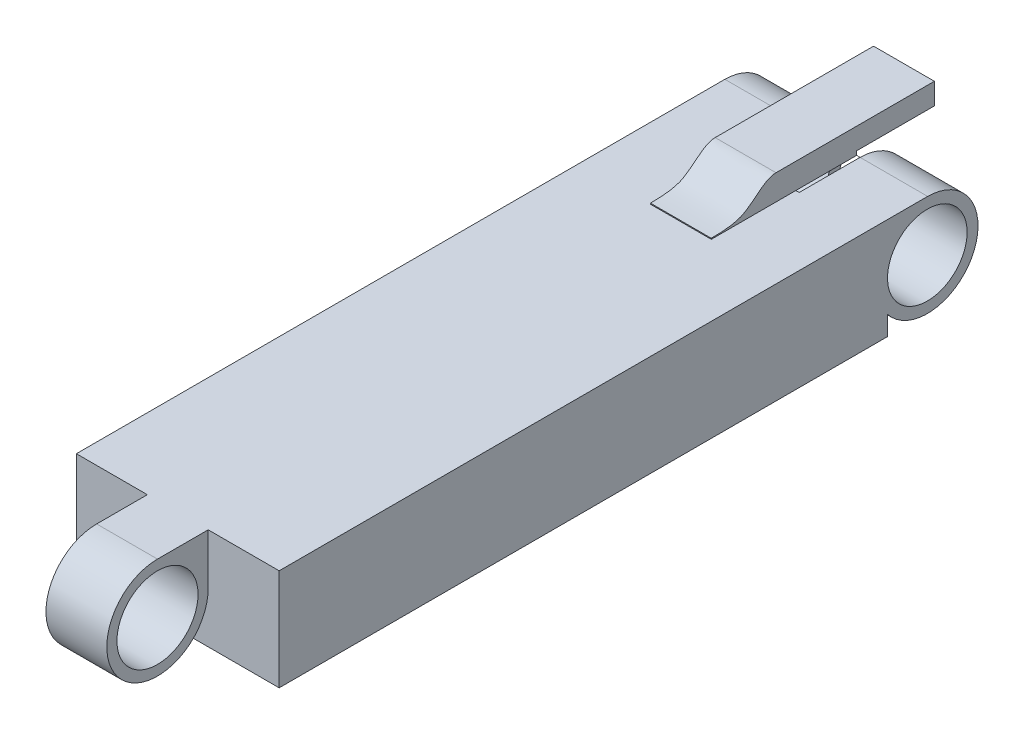
ISO-10303-21;
HEADER;
FILE_DESCRIPTION(('STEP AP214'),'2;1');
FILE_NAME('part.step','',(''),(''),'','','');
FILE_SCHEMA(('AUTOMOTIVE_DESIGN { 1 0 10303 214 1 1 1 1 }'));
ENDSEC;
DATA;
#1=APPLICATION_CONTEXT('core data for automotive mechanical design processes');
#2=APPLICATION_PROTOCOL_DEFINITION('international standard','automotive_design',2000,#1);
#3=PRODUCT_CONTEXT('',#1,'mechanical');
#4=PRODUCT('Part','Part','',(#3));
#5=PRODUCT_RELATED_PRODUCT_CATEGORY('part','',(#4));
#6=PRODUCT_DEFINITION_FORMATION('','',#4);
#7=PRODUCT_DEFINITION_CONTEXT('part definition',#1,'design');
#8=PRODUCT_DEFINITION('design','',#6,#7);
#9=PRODUCT_DEFINITION_SHAPE('','',#8);
#10=(LENGTH_UNIT() NAMED_UNIT(*) SI_UNIT(.MILLI.,.METRE.));
#11=(NAMED_UNIT(*) PLANE_ANGLE_UNIT() SI_UNIT($,.RADIAN.));
#12=(NAMED_UNIT(*) SI_UNIT($,.STERADIAN.) SOLID_ANGLE_UNIT());
#13=UNCERTAINTY_MEASURE_WITH_UNIT(LENGTH_MEASURE(1.E-05),#10,'distance_accuracy_value','');
#14=(GEOMETRIC_REPRESENTATION_CONTEXT(3) GLOBAL_UNCERTAINTY_ASSIGNED_CONTEXT((#13)) GLOBAL_UNIT_ASSIGNED_CONTEXT((#10,
#11,#12)) REPRESENTATION_CONTEXT('',''));
#15=CARTESIAN_POINT('',(0.,0.,0.));
#16=DIRECTION('',(0.,0.,1.));
#17=DIRECTION('',(1.,0.,0.));
#18=AXIS2_PLACEMENT_3D('',#15,#16,#17);
#19=CARTESIAN_POINT('',(10.,0.,0.));
#20=DIRECTION('',(0.,0.,1.));
#21=DIRECTION('',(1.,0.,0.));
#22=AXIS2_PLACEMENT_3D('',#19,#20,#21);
#23=PLANE('',#22);
#24=DIRECTION('',(1.,0.,0.));
#25=VECTOR('',#24,1.);
#26=CARTESIAN_POINT('',(3.5,2.5,0.));
#27=LINE('',#26,#25);
#28=CARTESIAN_POINT('',(3.5,2.5,0.));
#29=VERTEX_POINT('',#28);
#30=CARTESIAN_POINT('',(6.5,2.5,0.));
#31=VERTEX_POINT('',#30);
#32=EDGE_CURVE('E593',#29,#31,#27,.T.);
#33=ORIENTED_EDGE('',*,*,#32,.F.);
#34=DIRECTION('',(0.,1.,0.));
#35=VECTOR('',#34,1.);
#36=CARTESIAN_POINT('',(3.5,5.,0.));
#37=LINE('',#36,#35);
#38=CARTESIAN_POINT('',(3.5,5.,0.));
#39=VERTEX_POINT('',#38);
#40=EDGE_CURVE('E550',#29,#39,#37,.T.);
#41=ORIENTED_EDGE('',*,*,#40,.T.);
#42=DIRECTION('',(-1.,0.,0.));
#43=VECTOR('',#42,1.);
#44=CARTESIAN_POINT('',(10.,5.,0.));
#45=LINE('',#44,#43);
#46=CARTESIAN_POINT('',(0.,5.,0.));
#47=VERTEX_POINT('',#46);
#48=EDGE_CURVE('E420',#39,#47,#45,.T.);
#49=ORIENTED_EDGE('',*,*,#48,.T.);
#50=DIRECTION('',(0.,1.,0.));
#51=VECTOR('',#50,1.);
#52=CARTESIAN_POINT('',(0.,0.,0.));
#53=LINE('',#52,#51);
#54=CARTESIAN_POINT('',(0.,0.,0.));
#55=VERTEX_POINT('',#54);
#56=EDGE_CURVE('E529',#55,#47,#53,.T.);
#57=ORIENTED_EDGE('',*,*,#56,.F.);
#58=DIRECTION('',(-1.,0.,0.));
#59=VECTOR('',#58,1.);
#60=CARTESIAN_POINT('',(10.,0.,0.));
#61=LINE('',#60,#59);
#62=CARTESIAN_POINT('',(10.,0.,0.));
#63=VERTEX_POINT('',#62);
#64=EDGE_CURVE('E541',#63,#55,#61,.T.);
#65=ORIENTED_EDGE('',*,*,#64,.F.);
#66=DIRECTION('',(0.,1.,0.));
#67=VECTOR('',#66,1.);
#68=CARTESIAN_POINT('',(10.,0.,0.));
#69=LINE('',#68,#67);
#70=CARTESIAN_POINT('',(10.,5.,0.));
#71=VERTEX_POINT('',#70);
#72=EDGE_CURVE('E512',#63,#71,#69,.T.);
#73=ORIENTED_EDGE('',*,*,#72,.T.);
#74=CARTESIAN_POINT('',(6.5,5.,0.));
#75=VERTEX_POINT('',#74);
#76=EDGE_CURVE('E415',#71,#75,#45,.T.);
#77=ORIENTED_EDGE('',*,*,#76,.T.);
#78=DIRECTION('',(0.,1.,0.));
#79=VECTOR('',#78,1.);
#80=CARTESIAN_POINT('',(6.5,5.,0.));
#81=LINE('',#80,#79);
#82=EDGE_CURVE('E564',#31,#75,#81,.T.);
#83=ORIENTED_EDGE('',*,*,#82,.F.);
#84=EDGE_LOOP('',(#33,#41,#49,#57,#65,#73,#77,#83));
#85=FACE_BOUND('',#84,.T.);
#86=ADVANCED_FACE('F47',(#85),#23,.T.);
#87=CARTESIAN_POINT('',(10.,2.5,-31.9626369026869));
#88=DIRECTION('',(-1.,0.,0.));
#89=DIRECTION('',(0.,0.,1.));
#90=AXIS2_PLACEMENT_3D('',#87,#88,#89);
#91=CYLINDRICAL_SURFACE('',#90,1.96263690268693);
#92=CARTESIAN_POINT('',(6.66666666666667,2.5,-31.9626369026869));
#93=DIRECTION('',(1.,0.,0.));
#94=DIRECTION('',(0.,0.,-1.));
#95=AXIS2_PLACEMENT_3D('',#92,#93,#94);
#96=CIRCLE('',#95,1.96263690268693);
#97=CARTESIAN_POINT('',(6.66666666666667,2.5,-33.9252738053739));
#98=VERTEX_POINT('',#97);
#99=EDGE_CURVE('E451',#98,#98,#96,.T.);
#100=ORIENTED_EDGE('',*,*,#99,.F.);
#101=EDGE_LOOP('',(#100));
#102=FACE_BOUND('',#101,.T.);
#103=CARTESIAN_POINT('',(10.,2.5,-31.9626369026869));
#104=DIRECTION('',(1.,0.,0.));
#105=DIRECTION('',(0.,0.,-1.));
#106=AXIS2_PLACEMENT_3D('',#103,#104,#105);
#107=CIRCLE('',#106,1.96263690268693);
#108=CARTESIAN_POINT('',(10.,2.5,-33.9252738053739));
#109=VERTEX_POINT('',#108);
#110=EDGE_CURVE('E498',#109,#109,#107,.T.);
#111=ORIENTED_EDGE('',*,*,#110,.T.);
#112=EDGE_LOOP('',(#111));
#113=FACE_BOUND('',#112,.T.);
#114=ADVANCED_FACE('F365',(#102,#113),#91,.F.);
#115=CARTESIAN_POINT('',(10.,-0.208321197407538,-31.9449752607478));
#116=DIRECTION('',(0.,-0.00652111220123307,-0.999978737321779));
#117=DIRECTION('',(0.,0.999978737321779,-0.00652111220123307));
#118=AXIS2_PLACEMENT_3D('',#115,#116,#117);
#119=PLANE('',#118);
#120=DIRECTION('',(1.,0.,0.));
#121=VECTOR('',#120,1.);
#122=CARTESIAN_POINT('',(6.66666666666667,4.99994684330445,-31.97893968319));
#123=LINE('',#122,#121);
#124=CARTESIAN_POINT('',(3.33333333333333,4.99994684330445,-31.97893968319));
#125=VERTEX_POINT('',#124);
#126=CARTESIAN_POINT('',(6.66666666666667,4.99994684330445,-31.97893968319));
#127=VERTEX_POINT('',#126);
#128=EDGE_CURVE('E621',#125,#127,#123,.T.);
#129=ORIENTED_EDGE('',*,*,#128,.F.);
#130=DIRECTION('',(-1.,0.,0.));
#131=VECTOR('',#130,1.);
#132=CARTESIAN_POINT('',(3.33333333333333,4.99994684330445,-31.97893968319));
#133=LINE('',#132,#131);
#134=CARTESIAN_POINT('',(0.,4.99994684330445,-31.97893968319));
#135=VERTEX_POINT('',#134);
#136=EDGE_CURVE('E493',#135,#125,#133,.F.);
#137=ORIENTED_EDGE('',*,*,#136,.F.);
#138=DIRECTION('',(0.,-0.999978737321779,0.00652111220123306));
#139=VECTOR('',#138,1.);
#140=CARTESIAN_POINT('',(0.,-0.208321197407538,-31.9449752607478));
#141=LINE('',#140,#139);
#142=CARTESIAN_POINT('',(0.,5.,-31.9789400298382));
#143=VERTEX_POINT('',#142);
#144=EDGE_CURVE('E412',#143,#135,#141,.T.);
#145=ORIENTED_EDGE('',*,*,#144,.F.);
#146=DIRECTION('',(-1.,0.,0.));
#147=VECTOR('',#146,1.);
#148=CARTESIAN_POINT('',(10.,5.,-31.9789400298382));
#149=LINE('',#148,#147);
#150=CARTESIAN_POINT('',(3.5,5.,-31.9789400298382));
#151=VERTEX_POINT('',#150);
#152=EDGE_CURVE('E395',#151,#143,#149,.T.);
#153=ORIENTED_EDGE('',*,*,#152,.F.);
#154=DIRECTION('',(-1.,0.,0.));
#155=VECTOR('',#154,1.);
#156=CARTESIAN_POINT('',(10.,5.,-31.9789400298382));
#157=LINE('',#156,#155);
#158=CARTESIAN_POINT('',(6.5,5.,-31.9789400298382));
#159=VERTEX_POINT('',#158);
#160=EDGE_CURVE('E409',#159,#151,#157,.T.);
#161=ORIENTED_EDGE('',*,*,#160,.F.);
#162=CARTESIAN_POINT('',(10.,5.,-31.9789400298382));
#163=VERTEX_POINT('',#162);
#164=EDGE_CURVE('E414',#163,#159,#149,.T.);
#165=ORIENTED_EDGE('',*,*,#164,.F.);
#166=DIRECTION('',(0.,-0.999978737321779,0.00652111220123306));
#167=VECTOR('',#166,1.);
#168=CARTESIAN_POINT('',(10.,-0.208321197407538,-31.9449752607478));
#169=LINE('',#168,#167);
#170=CARTESIAN_POINT('',(10.,4.99994684330445,-31.97893968319));
#171=VERTEX_POINT('',#170);
#172=EDGE_CURVE('E505',#163,#171,#169,.T.);
#173=ORIENTED_EDGE('',*,*,#172,.T.);
#174=DIRECTION('',(1.,0.,0.));
#175=VECTOR('',#174,1.);
#176=CARTESIAN_POINT('',(6.66666666666667,4.99994684330445,-31.97893968319));
#177=LINE('',#176,#175);
#178=EDGE_CURVE('E474',#127,#171,#177,.T.);
#179=ORIENTED_EDGE('',*,*,#178,.F.);
#180=EDGE_LOOP('',(#129,#137,#145,#153,#161,#165,#173,#179));
#181=FACE_BOUND('',#180,.T.);
#182=ADVANCED_FACE('F49',(#181),#119,.T.);
#183=CARTESIAN_POINT('',(10.,5.,0.));
#184=DIRECTION('',(0.,1.,0.));
#185=DIRECTION('',(0.,0.,1.));
#186=AXIS2_PLACEMENT_3D('',#183,#184,#185);
#187=PLANE('',#186);
#188=DIRECTION('',(0.,0.,-1.));
#189=VECTOR('',#188,1.);
#190=CARTESIAN_POINT('',(3.5,5.,-24.8091377548968));
#191=LINE('',#190,#189);
#192=CARTESIAN_POINT('',(3.5,5.,-31.9707883796));
#193=VERTEX_POINT('',#192);
#194=EDGE_CURVE('E392',#193,#151,#191,.T.);
#195=ORIENTED_EDGE('',*,*,#194,.T.);
#196=ORIENTED_EDGE('',*,*,#152,.T.);
#197=DIRECTION('',(0.,0.,-1.));
#198=VECTOR('',#197,1.);
#199=CARTESIAN_POINT('',(0.,5.,0.));
#200=LINE('',#199,#198);
#201=EDGE_CURVE('E526',#47,#143,#200,.T.);
#202=ORIENTED_EDGE('',*,*,#201,.F.);
#203=ORIENTED_EDGE('',*,*,#48,.F.);
#204=DIRECTION('',(0.,0.,1.));
#205=VECTOR('',#204,1.);
#206=CARTESIAN_POINT('',(3.5,5.,2.5));
#207=LINE('',#206,#205);
#208=CARTESIAN_POINT('',(3.5,5.,2.5));
#209=VERTEX_POINT('',#208);
#210=EDGE_CURVE('E590',#39,#209,#207,.T.);
#211=ORIENTED_EDGE('',*,*,#210,.T.);
#212=DIRECTION('',(1.,0.,0.));
#213=VECTOR('',#212,1.);
#214=CARTESIAN_POINT('',(3.5,5.,2.5));
#215=LINE('',#214,#213);
#216=CARTESIAN_POINT('',(6.5,5.,2.5));
#217=VERTEX_POINT('',#216);
#218=EDGE_CURVE('E575',#209,#217,#215,.T.);
#219=ORIENTED_EDGE('',*,*,#218,.T.);
#220=DIRECTION('',(0.,0.,1.));
#221=VECTOR('',#220,1.);
#222=CARTESIAN_POINT('',(6.5,5.,2.5));
#223=LINE('',#222,#221);
#224=EDGE_CURVE('E570',#75,#217,#223,.T.);
#225=ORIENTED_EDGE('',*,*,#224,.F.);
#226=ORIENTED_EDGE('',*,*,#76,.F.);
#227=DIRECTION('',(0.,0.,-1.));
#228=VECTOR('',#227,1.);
#229=CARTESIAN_POINT('',(10.,5.,0.));
#230=LINE('',#229,#228);
#231=EDGE_CURVE('E508',#71,#163,#230,.T.);
#232=ORIENTED_EDGE('',*,*,#231,.T.);
#233=ORIENTED_EDGE('',*,*,#164,.T.);
#234=DIRECTION('',(0.,0.,-1.));
#235=VECTOR('',#234,1.);
#236=CARTESIAN_POINT('',(6.5,5.,-24.8091377548968));
#237=LINE('',#236,#235);
#238=CARTESIAN_POINT('',(6.5,5.,-31.9707883796));
#239=VERTEX_POINT('',#238);
#240=EDGE_CURVE('E277',#239,#159,#237,.T.);
#241=ORIENTED_EDGE('',*,*,#240,.F.);
#242=DIRECTION('',(-1.,0.,0.));
#243=VECTOR('',#242,1.);
#244=CARTESIAN_POINT('',(10.,5.,-31.9707883796));
#245=LINE('',#244,#243);
#246=CARTESIAN_POINT('',(6.66666666666667,5.,-31.9707883796));
#247=VERTEX_POINT('',#246);
#248=EDGE_CURVE('E11',#247,#239,#245,.T.);
#249=ORIENTED_EDGE('',*,*,#248,.F.);
#250=DIRECTION('',(0.,0.,-1.));
#251=VECTOR('',#250,1.);
#252=CARTESIAN_POINT('',(6.66666666666667,5.,0.));
#253=LINE('',#252,#251);
#254=CARTESIAN_POINT('',(6.66666666666667,5.,-28.9788762404472));
#255=VERTEX_POINT('',#254);
#256=EDGE_CURVE('E460',#255,#247,#253,.T.);
#257=ORIENTED_EDGE('',*,*,#256,.F.);
#258=DIRECTION('',(-1.,0.,0.));
#259=VECTOR('',#258,1.);
#260=CARTESIAN_POINT('',(10.,5.,-28.9788762404472));
#261=LINE('',#260,#259);
#262=CARTESIAN_POINT('',(6.5,5.,-28.9788762404472));
#263=VERTEX_POINT('',#262);
#264=EDGE_CURVE('E423',#255,#263,#261,.T.);
#265=ORIENTED_EDGE('',*,*,#264,.T.);
#266=CARTESIAN_POINT('',(6.5,5.,-24.8091377548968));
#267=VERTEX_POINT('',#266);
#268=EDGE_CURVE('E278',#267,#263,#237,.T.);
#269=ORIENTED_EDGE('',*,*,#268,.F.);
#270=DIRECTION('',(1.,0.,0.));
#271=VECTOR('',#270,1.);
#272=CARTESIAN_POINT('',(3.5,5.,-24.8091377548968));
#273=LINE('',#272,#271);
#274=CARTESIAN_POINT('',(3.5,5.,-24.8091377548968));
#275=VERTEX_POINT('',#274);
#276=EDGE_CURVE('E71',#275,#267,#273,.T.);
#277=ORIENTED_EDGE('',*,*,#276,.F.);
#278=CARTESIAN_POINT('',(3.5,5.,-28.9788762404472));
#279=VERTEX_POINT('',#278);
#280=EDGE_CURVE('E404',#275,#279,#191,.T.);
#281=ORIENTED_EDGE('',*,*,#280,.T.);
#282=CARTESIAN_POINT('',(3.33333333333333,5.,-28.9788762404472));
#283=VERTEX_POINT('',#282);
#284=EDGE_CURVE('E419',#279,#283,#261,.T.);
#285=ORIENTED_EDGE('',*,*,#284,.T.);
#286=DIRECTION('',(0.,0.,1.));
#287=VECTOR('',#286,1.);
#288=CARTESIAN_POINT('',(3.33333333333333,5.,0.));
#289=LINE('',#288,#287);
#290=CARTESIAN_POINT('',(3.33333333333333,4.99999999999997,-31.9707883796089));
#291=VERTEX_POINT('',#290);
#292=EDGE_CURVE('E435',#291,#283,#289,.T.);
#293=ORIENTED_EDGE('',*,*,#292,.F.);
#294=EDGE_CURVE('E56',#193,#291,#245,.T.);
#295=ORIENTED_EDGE('',*,*,#294,.F.);
#296=EDGE_LOOP('',(#195,#196,#202,#203,#211,#219,#225,#226,#232,#233,#241,#249,#257,#265,#269,
#277,#281,#285,#293,#295));
#297=FACE_BOUND('',#296,.T.);
#298=ADVANCED_FACE('F380',(#297),#187,.T.);
#299=CARTESIAN_POINT('',(10.,0.,0.));
#300=DIRECTION('',(0.,1.,0.));
#301=DIRECTION('',(0.,0.,1.));
#302=AXIS2_PLACEMENT_3D('',#299,#300,#301);
#303=PLANE('',#302);
#304=DIRECTION('',(-1.,0.,0.));
#305=VECTOR('',#304,1.);
#306=CARTESIAN_POINT('',(10.,0.,-29.9836551410445));
#307=LINE('',#306,#305);
#308=CARTESIAN_POINT('',(6.66666666666667,0.,-29.9836551410445));
#309=VERTEX_POINT('',#308);
#310=CARTESIAN_POINT('',(3.33333333333333,0.,-29.9836551410445));
#311=VERTEX_POINT('',#310);
#312=EDGE_CURVE('E614',#309,#311,#307,.T.);
#313=ORIENTED_EDGE('',*,*,#312,.T.);
#314=DIRECTION('',(0.,0.,1.));
#315=VECTOR('',#314,1.);
#316=CARTESIAN_POINT('',(3.33333333333333,0.,0.));
#317=LINE('',#316,#315);
#318=CARTESIAN_POINT('',(3.33333333333333,0.,-28.9462699861447));
#319=VERTEX_POINT('',#318);
#320=EDGE_CURVE('E618',#311,#319,#317,.T.);
#321=ORIENTED_EDGE('',*,*,#320,.T.);
#322=DIRECTION('',(1.,0.,0.));
#323=VECTOR('',#322,1.);
#324=CARTESIAN_POINT('',(10.,0.,-28.9462699861447));
#325=LINE('',#324,#323);
#326=CARTESIAN_POINT('',(6.66666666666667,0.,-28.9462699861447));
#327=VERTEX_POINT('',#326);
#328=EDGE_CURVE('E439',#319,#327,#325,.T.);
#329=ORIENTED_EDGE('',*,*,#328,.T.);
#330=DIRECTION('',(0.,0.,-1.));
#331=VECTOR('',#330,1.);
#332=CARTESIAN_POINT('',(6.66666666666667,0.,0.));
#333=LINE('',#332,#331);
#334=EDGE_CURVE('E610',#327,#309,#333,.T.);
#335=ORIENTED_EDGE('',*,*,#334,.T.);
#336=EDGE_LOOP('',(#313,#321,#329,#335));
#337=FACE_BOUND('',#336,.T.);
#338=DIRECTION('',(0.,0.,-1.));
#339=VECTOR('',#338,1.);
#340=CARTESIAN_POINT('',(0.,0.,0.));
#341=LINE('',#340,#339);
#342=CARTESIAN_POINT('',(0.,0.,-30.));
#343=VERTEX_POINT('',#342);
#344=EDGE_CURVE('E533',#55,#343,#341,.T.);
#345=ORIENTED_EDGE('',*,*,#344,.T.);
#346=DIRECTION('',(-1.,0.,0.));
#347=VECTOR('',#346,1.);
#348=CARTESIAN_POINT('',(10.,0.,-30.));
#349=LINE('',#348,#347);
#350=CARTESIAN_POINT('',(10.,0.,-30.));
#351=VERTEX_POINT('',#350);
#352=EDGE_CURVE('E523',#351,#343,#349,.T.);
#353=ORIENTED_EDGE('',*,*,#352,.F.);
#354=DIRECTION('',(0.,0.,-1.));
#355=VECTOR('',#354,1.);
#356=CARTESIAN_POINT('',(10.,0.,0.));
#357=LINE('',#356,#355);
#358=EDGE_CURVE('E516',#63,#351,#357,.T.);
#359=ORIENTED_EDGE('',*,*,#358,.F.);
#360=ORIENTED_EDGE('',*,*,#64,.T.);
#361=EDGE_LOOP('',(#345,#353,#359,#360));
#362=FACE_BOUND('',#361,.T.);
#363=ADVANCED_FACE('F376',(#337,#362),#303,.F.);
#364=CARTESIAN_POINT('',(10.,0.,-30.));
#365=DIRECTION('',(0.,0.,1.));
#366=DIRECTION('',(1.,0.,0.));
#367=AXIS2_PLACEMENT_3D('',#364,#365,#366);
#368=PLANE('',#367);
#369=DIRECTION('',(1.,0.,0.));
#370=VECTOR('',#369,1.);
#371=CARTESIAN_POINT('',(10.,0.0127456897646467,-30.));
#372=LINE('',#371,#370);
#373=CARTESIAN_POINT('',(3.33333333333333,0.0127456897646467,-30.));
#374=VERTEX_POINT('',#373);
#375=CARTESIAN_POINT('',(6.66666666666667,0.0127456897646467,-30.));
#376=VERTEX_POINT('',#375);
#377=EDGE_CURVE('E631',#374,#376,#372,.T.);
#378=ORIENTED_EDGE('',*,*,#377,.T.);
#379=DIRECTION('',(0.,1.,0.));
#380=VECTOR('',#379,1.);
#381=CARTESIAN_POINT('',(6.66666666666667,0.,-30.));
#382=LINE('',#381,#380);
#383=CARTESIAN_POINT('',(6.66666666666667,0.951434086578337,-30.));
#384=VERTEX_POINT('',#383);
#385=EDGE_CURVE('E641',#376,#384,#382,.T.);
#386=ORIENTED_EDGE('',*,*,#385,.T.);
#387=DIRECTION('',(1.,0.,0.));
#388=VECTOR('',#387,1.);
#389=CARTESIAN_POINT('',(6.66666666666667,0.951434086578337,-30.));
#390=LINE('',#389,#388);
#391=CARTESIAN_POINT('',(10.,0.951434086578337,-30.));
#392=VERTEX_POINT('',#391);
#393=EDGE_CURVE('E467',#384,#392,#390,.T.);
#394=ORIENTED_EDGE('',*,*,#393,.T.);
#395=DIRECTION('',(0.,1.,0.));
#396=VECTOR('',#395,1.);
#397=CARTESIAN_POINT('',(10.,0.,-30.));
#398=LINE('',#397,#396);
#399=EDGE_CURVE('E519',#351,#392,#398,.T.);
#400=ORIENTED_EDGE('',*,*,#399,.F.);
#401=ORIENTED_EDGE('',*,*,#352,.T.);
#402=DIRECTION('',(0.,1.,0.));
#403=VECTOR('',#402,1.);
#404=CARTESIAN_POINT('',(0.,0.,-30.));
#405=LINE('',#404,#403);
#406=CARTESIAN_POINT('',(0.,0.951434086578338,-30.));
#407=VERTEX_POINT('',#406);
#408=EDGE_CURVE('E509',#343,#407,#405,.T.);
#409=ORIENTED_EDGE('',*,*,#408,.T.);
#410=DIRECTION('',(-1.,0.,0.));
#411=VECTOR('',#410,1.);
#412=CARTESIAN_POINT('',(3.33333333333333,0.951434086578338,-30.));
#413=LINE('',#412,#411);
#414=CARTESIAN_POINT('',(3.33333333333333,0.951434086578338,-30.));
#415=VERTEX_POINT('',#414);
#416=EDGE_CURVE('E486',#407,#415,#413,.F.);
#417=ORIENTED_EDGE('',*,*,#416,.T.);
#418=DIRECTION('',(0.,-1.,0.));
#419=VECTOR('',#418,1.);
#420=CARTESIAN_POINT('',(3.33333333333333,0.,-30.));
#421=LINE('',#420,#419);
#422=EDGE_CURVE('E452',#415,#374,#421,.T.);
#423=ORIENTED_EDGE('',*,*,#422,.T.);
#424=EDGE_LOOP('',(#378,#386,#394,#400,#401,#409,#417,#423));
#425=FACE_BOUND('',#424,.T.);
#426=ADVANCED_FACE('F369',(#425),#368,.F.);
#427=CARTESIAN_POINT('',(10.,0.,0.));
#428=DIRECTION('',(1.,0.,0.));
#429=DIRECTION('',(0.,0.,-1.));
#430=AXIS2_PLACEMENT_3D('',#427,#428,#429);
#431=PLANE('',#430);
#432=ORIENTED_EDGE('',*,*,#110,.F.);
#433=EDGE_LOOP('',(#432));
#434=FACE_BOUND('',#433,.T.);
#435=ORIENTED_EDGE('',*,*,#399,.T.);
#436=CARTESIAN_POINT('',(10.,2.5,-31.9626369026869));
#437=DIRECTION('',(1.,0.,0.));
#438=DIRECTION('',(0.,0.,-1.));
#439=AXIS2_PLACEMENT_3D('',#436,#437,#438);
#440=CIRCLE('',#439,2.5);
#441=EDGE_CURVE('E457',#392,#171,#440,.T.);
#442=ORIENTED_EDGE('',*,*,#441,.T.);
#443=ORIENTED_EDGE('',*,*,#172,.F.);
#444=ORIENTED_EDGE('',*,*,#231,.F.);
#445=ORIENTED_EDGE('',*,*,#72,.F.);
#446=ORIENTED_EDGE('',*,*,#358,.T.);
#447=EDGE_LOOP('',(#435,#442,#443,#444,#445,#446));
#448=FACE_BOUND('',#447,.T.);
#449=ADVANCED_FACE('F366',(#434,#448),#431,.T.);
#450=CARTESIAN_POINT('',(0.,0.,0.));
#451=DIRECTION('',(1.,0.,0.));
#452=DIRECTION('',(0.,0.,-1.));
#453=AXIS2_PLACEMENT_3D('',#450,#451,#452);
#454=PLANE('',#453);
#455=ORIENTED_EDGE('',*,*,#144,.T.);
#456=CARTESIAN_POINT('',(0.,2.5,-31.9626369026869));
#457=DIRECTION('',(-1.,0.,0.));
#458=DIRECTION('',(0.,0.,1.));
#459=AXIS2_PLACEMENT_3D('',#456,#457,#458);
#460=CIRCLE('',#459,2.5);
#461=EDGE_CURVE('E482',#135,#407,#460,.T.);
#462=ORIENTED_EDGE('',*,*,#461,.T.);
#463=ORIENTED_EDGE('',*,*,#408,.F.);
#464=ORIENTED_EDGE('',*,*,#344,.F.);
#465=ORIENTED_EDGE('',*,*,#56,.T.);
#466=ORIENTED_EDGE('',*,*,#201,.T.);
#467=EDGE_LOOP('',(#455,#462,#463,#464,#465,#466));
#468=FACE_BOUND('',#467,.T.);
#469=CARTESIAN_POINT('',(0.,2.5,-31.9626369026869));
#470=DIRECTION('',(1.,0.,0.));
#471=DIRECTION('',(0.,0.,-1.));
#472=AXIS2_PLACEMENT_3D('',#469,#470,#471);
#473=CIRCLE('',#472,1.96263690268693);
#474=CARTESIAN_POINT('',(0.,2.5,-33.9252738053739));
#475=VERTEX_POINT('',#474);
#476=EDGE_CURVE('E497',#475,#475,#473,.T.);
#477=ORIENTED_EDGE('',*,*,#476,.T.);
#478=EDGE_LOOP('',(#477));
#479=FACE_BOUND('',#478,.T.);
#480=ADVANCED_FACE('F363',(#468,#479),#454,.F.);
#481=CARTESIAN_POINT('',(3.33333333333333,2.5,-31.9626369026869));
#482=DIRECTION('',(-1.,0.,0.));
#483=DIRECTION('',(0.,0.,1.));
#484=AXIS2_PLACEMENT_3D('',#481,#482,#483);
#485=CIRCLE('',#484,1.96263690268693);
#486=CARTESIAN_POINT('',(3.33333333333333,2.5,-30.));
#487=VERTEX_POINT('',#486);
#488=EDGE_CURVE('E478',#487,#487,#485,.T.);
#489=ORIENTED_EDGE('',*,*,#488,.F.);
#490=EDGE_LOOP('',(#489));
#491=FACE_BOUND('',#490,.T.);
#492=ORIENTED_EDGE('',*,*,#476,.F.);
#493=EDGE_LOOP('',(#492));
#494=FACE_BOUND('',#493,.T.);
#495=ADVANCED_FACE('F359',(#491,#494),#91,.F.);
#496=CARTESIAN_POINT('',(3.33333333333333,2.5,-31.9626369026869));
#497=DIRECTION('',(-1.,0.,0.));
#498=DIRECTION('',(0.,0.,1.));
#499=AXIS2_PLACEMENT_3D('',#496,#497,#498);
#500=CYLINDRICAL_SURFACE('',#499,2.5);
#501=ORIENTED_EDGE('',*,*,#461,.F.);
#502=ORIENTED_EDGE('',*,*,#136,.T.);
#503=CARTESIAN_POINT('',(3.33333333333333,2.5,-31.9626369026869));
#504=DIRECTION('',(-1.,0.,0.));
#505=DIRECTION('',(0.,0.,1.));
#506=AXIS2_PLACEMENT_3D('',#503,#504,#505);
#507=CIRCLE('',#506,2.5);
#508=EDGE_CURVE('E483',#125,#415,#507,.T.);
#509=ORIENTED_EDGE('',*,*,#508,.T.);
#510=ORIENTED_EDGE('',*,*,#416,.F.);
#511=EDGE_LOOP('',(#501,#502,#509,#510));
#512=FACE_BOUND('',#511,.T.);
#513=ADVANCED_FACE('F355',(#512),#500,.T.);
#514=CARTESIAN_POINT('',(3.33333333333333,2.5,-31.9626369026869));
#515=DIRECTION('',(-1.,0.,0.));
#516=DIRECTION('',(0.,0.,1.));
#517=AXIS2_PLACEMENT_3D('',#514,#515,#516);
#518=PLANE('',#517);
#519=ORIENTED_EDGE('',*,*,#422,.F.);
#520=ORIENTED_EDGE('',*,*,#508,.F.);
#521=DIRECTION('',(0.,-0.00652111220123307,-0.999978737321779));
#522=VECTOR('',#521,1.);
#523=CARTESIAN_POINT('',(3.33333333333333,5.01951017990815,-28.9790034712247));
#524=LINE('',#523,#522);
#525=EDGE_CURVE('E449',#291,#125,#524,.T.);
#526=ORIENTED_EDGE('',*,*,#525,.F.);
#527=ORIENTED_EDGE('',*,*,#292,.T.);
#528=DIRECTION('',(0.,0.999978737321779,-0.00652111220123263));
#529=VECTOR('',#528,1.);
#530=CARTESIAN_POINT('',(3.33333333333333,5.01951017990815,-28.9790034712247));
#531=LINE('',#530,#529);
#532=EDGE_CURVE('E437',#319,#283,#531,.T.);
#533=ORIENTED_EDGE('',*,*,#532,.F.);
#534=ORIENTED_EDGE('',*,*,#320,.F.);
#535=DIRECTION('',(0.,0.999978737321779,-0.00652111220123307));
#536=VECTOR('',#535,1.);
#537=CARTESIAN_POINT('',(3.33333333333333,-0.195522621954839,-29.9823800889778));
#538=LINE('',#537,#536);
#539=CARTESIAN_POINT('',(3.33333333333333,0.0128517321482529,-29.9837389504138));
#540=VERTEX_POINT('',#539);
#541=EDGE_CURVE('E603',#311,#540,#538,.T.);
#542=ORIENTED_EDGE('',*,*,#541,.T.);
#543=DIRECTION('',(0.,-0.00652111220123307,-0.999978737321779));
#544=VECTOR('',#543,1.);
#545=CARTESIAN_POINT('',(3.33333333333333,0.0196164932992501,-28.9463979102185));
#546=LINE('',#545,#544);
#547=EDGE_CURVE('E634',#540,#374,#546,.T.);
#548=ORIENTED_EDGE('',*,*,#547,.T.);
#549=EDGE_LOOP('',(#519,#520,#526,#527,#533,#534,#542,#548));
#550=FACE_BOUND('',#549,.T.);
#551=ORIENTED_EDGE('',*,*,#488,.T.);
#552=EDGE_LOOP('',(#551));
#553=FACE_BOUND('',#552,.T.);
#554=ADVANCED_FACE('F351',(#550,#553),#518,.F.);
#555=CARTESIAN_POINT('',(6.66666666666667,2.5,-31.9626369026869));
#556=DIRECTION('',(1.,0.,0.));
#557=DIRECTION('',(0.,0.,-1.));
#558=AXIS2_PLACEMENT_3D('',#555,#556,#557);
#559=CYLINDRICAL_SURFACE('',#558,2.5);
#560=CARTESIAN_POINT('',(6.66666666666667,2.5,-31.9626369026869));
#561=DIRECTION('',(1.,0.,0.));
#562=DIRECTION('',(0.,0.,-1.));
#563=AXIS2_PLACEMENT_3D('',#560,#561,#562);
#564=CIRCLE('',#563,2.5);
#565=EDGE_CURVE('E464',#384,#127,#564,.T.);
#566=ORIENTED_EDGE('',*,*,#565,.T.);
#567=ORIENTED_EDGE('',*,*,#178,.T.);
#568=ORIENTED_EDGE('',*,*,#441,.F.);
#569=ORIENTED_EDGE('',*,*,#393,.F.);
#570=EDGE_LOOP('',(#566,#567,#568,#569));
#571=FACE_BOUND('',#570,.T.);
#572=ADVANCED_FACE('F347',(#571),#559,.T.);
#573=CARTESIAN_POINT('',(6.66666666666667,2.5,-31.9626369026869));
#574=DIRECTION('',(1.,0.,0.));
#575=DIRECTION('',(0.,0.,-1.));
#576=AXIS2_PLACEMENT_3D('',#573,#574,#575);
#577=PLANE('',#576);
#578=ORIENTED_EDGE('',*,*,#99,.T.);
#579=EDGE_LOOP('',(#578));
#580=FACE_BOUND('',#579,.T.);
#581=DIRECTION('',(0.,-0.00652111220123307,-0.999978737321779));
#582=VECTOR('',#581,1.);
#583=CARTESIAN_POINT('',(6.66666666666667,5.01951017990815,-28.9790034712247));
#584=LINE('',#583,#582);
#585=EDGE_CURVE('E627',#247,#127,#584,.T.);
#586=ORIENTED_EDGE('',*,*,#585,.T.);
#587=ORIENTED_EDGE('',*,*,#565,.F.);
#588=ORIENTED_EDGE('',*,*,#385,.F.);
#589=DIRECTION('',(0.,-0.00652111220123307,-0.999978737321779));
#590=VECTOR('',#589,1.);
#591=CARTESIAN_POINT('',(6.66666666666667,0.0196164932992501,-28.9463979102185));
#592=LINE('',#591,#590);
#593=CARTESIAN_POINT('',(6.66666666666667,0.0128517321482529,-29.9837389504138));
#594=VERTEX_POINT('',#593);
#595=EDGE_CURVE('E442',#594,#376,#592,.T.);
#596=ORIENTED_EDGE('',*,*,#595,.F.);
#597=DIRECTION('',(0.,0.999978737321779,-0.00652111220123307));
#598=VECTOR('',#597,1.);
#599=CARTESIAN_POINT('',(6.66666666666667,-0.195522621954839,-29.9823800889778));
#600=LINE('',#599,#598);
#601=EDGE_CURVE('E602',#309,#594,#600,.T.);
#602=ORIENTED_EDGE('',*,*,#601,.F.);
#603=ORIENTED_EDGE('',*,*,#334,.F.);
#604=DIRECTION('',(0.,-0.999978737321779,0.00652111220123263));
#605=VECTOR('',#604,1.);
#606=CARTESIAN_POINT('',(6.66666666666667,5.01951017990815,-28.9790034712247));
#607=LINE('',#606,#605);
#608=EDGE_CURVE('E443',#255,#327,#607,.T.);
#609=ORIENTED_EDGE('',*,*,#608,.F.);
#610=ORIENTED_EDGE('',*,*,#256,.T.);
#611=EDGE_LOOP('',(#586,#587,#588,#596,#602,#603,#609,#610));
#612=FACE_BOUND('',#611,.T.);
#613=ADVANCED_FACE('F343',(#580,#612),#577,.F.);
#614=CARTESIAN_POINT('',(6.66666666666667,0.0196164932992501,-28.9463979102185));
#615=DIRECTION('',(0.,-0.999978737321779,0.00652111220123307));
#616=DIRECTION('',(0.,-0.00652111220123307,-0.999978737321779));
#617=AXIS2_PLACEMENT_3D('',#614,#615,#616);
#618=PLANE('',#617);
#619=ORIENTED_EDGE('',*,*,#547,.F.);
#620=DIRECTION('',(-1.,0.,0.));
#621=VECTOR('',#620,1.);
#622=CARTESIAN_POINT('',(3.33333333333333,0.0128517321482529,-29.9837389504138));
#623=LINE('',#622,#621);
#624=EDGE_CURVE('E596',#594,#540,#623,.T.);
#625=ORIENTED_EDGE('',*,*,#624,.F.);
#626=ORIENTED_EDGE('',*,*,#595,.T.);
#627=ORIENTED_EDGE('',*,*,#377,.F.);
#628=EDGE_LOOP('',(#619,#625,#626,#627));
#629=FACE_BOUND('',#628,.T.);
#630=ADVANCED_FACE('F339',(#629),#618,.F.);
#631=CARTESIAN_POINT('',(6.66666666666667,5.01951017990815,-28.9790034712247));
#632=DIRECTION('',(0.,0.999978737321779,-0.00652111220123307));
#633=DIRECTION('',(0.,0.00652111220123307,0.999978737321779));
#634=AXIS2_PLACEMENT_3D('',#631,#632,#633);
#635=PLANE('',#634);
#636=ORIENTED_EDGE('',*,*,#248,.T.);
#637=DIRECTION('',(-1.,0.,0.));
#638=VECTOR('',#637,1.);
#639=CARTESIAN_POINT('',(6.66666666666667,5.,-31.9707883796));
#640=LINE('',#639,#638);
#641=EDGE_CURVE('E656',#239,#193,#640,.T.);
#642=ORIENTED_EDGE('',*,*,#641,.T.);
#643=ORIENTED_EDGE('',*,*,#294,.T.);
#644=ORIENTED_EDGE('',*,*,#525,.T.);
#645=ORIENTED_EDGE('',*,*,#128,.T.);
#646=ORIENTED_EDGE('',*,*,#585,.F.);
#647=EDGE_LOOP('',(#636,#642,#643,#644,#645,#646));
#648=FACE_BOUND('',#647,.T.);
#649=ADVANCED_FACE('F335',(#648),#635,.F.);
#650=CARTESIAN_POINT('',(0.,-0.188757860803825,-28.9450390487825));
#651=DIRECTION('',(0.,-0.00652111220123263,-0.999978737321779));
#652=DIRECTION('',(0.,0.999978737321779,-0.00652111220123263));
#653=AXIS2_PLACEMENT_3D('',#650,#651,#652);
#654=PLANE('',#653);
#655=ORIENTED_EDGE('',*,*,#608,.T.);
#656=ORIENTED_EDGE('',*,*,#328,.F.);
#657=ORIENTED_EDGE('',*,*,#532,.T.);
#658=ORIENTED_EDGE('',*,*,#284,.F.);
#659=EDGE_CURVE('E426',#263,#279,#261,.T.);
#660=ORIENTED_EDGE('',*,*,#659,.F.);
#661=ORIENTED_EDGE('',*,*,#264,.F.);
#662=EDGE_LOOP('',(#655,#656,#657,#658,#660,#661));
#663=FACE_BOUND('',#662,.T.);
#664=ADVANCED_FACE('F331',(#663),#654,.T.);
#665=CARTESIAN_POINT('',(3.33333333333333,-0.195522621954839,-29.9823800889778));
#666=DIRECTION('',(0.,-0.00652111220123307,-0.999978737321779));
#667=DIRECTION('',(0.,0.999978737321779,-0.00652111220123307));
#668=AXIS2_PLACEMENT_3D('',#665,#666,#667);
#669=PLANE('',#668);
#670=ORIENTED_EDGE('',*,*,#601,.T.);
#671=ORIENTED_EDGE('',*,*,#624,.T.);
#672=ORIENTED_EDGE('',*,*,#541,.F.);
#673=ORIENTED_EDGE('',*,*,#312,.F.);
#674=EDGE_LOOP('',(#670,#671,#672,#673));
#675=FACE_BOUND('',#674,.T.);
#676=ADVANCED_FACE('F327',(#675),#669,.F.);
#677=CARTESIAN_POINT('',(3.5,2.5,2.5));
#678=DIRECTION('',(1.,0.,0.));
#679=DIRECTION('',(0.,0.,-1.));
#680=AXIS2_PLACEMENT_3D('',#677,#678,#679);
#681=CYLINDRICAL_SURFACE('',#680,2.5);
#682=ORIENTED_EDGE('',*,*,#32,.T.);
#683=CARTESIAN_POINT('',(6.5,2.5,2.5));
#684=DIRECTION('',(1.,0.,0.));
#685=DIRECTION('',(0.,0.,-1.));
#686=AXIS2_PLACEMENT_3D('',#683,#684,#685);
#687=CIRCLE('',#686,2.5);
#688=EDGE_CURVE('E572',#217,#31,#687,.T.);
#689=ORIENTED_EDGE('',*,*,#688,.F.);
#690=ORIENTED_EDGE('',*,*,#218,.F.);
#691=CARTESIAN_POINT('',(3.5,2.5,2.5));
#692=DIRECTION('',(1.,0.,0.));
#693=DIRECTION('',(0.,0.,-1.));
#694=AXIS2_PLACEMENT_3D('',#691,#692,#693);
#695=CIRCLE('',#694,2.5);
#696=EDGE_CURVE('E581',#209,#29,#695,.T.);
#697=ORIENTED_EDGE('',*,*,#696,.T.);
#698=EDGE_LOOP('',(#682,#689,#690,#697));
#699=FACE_BOUND('',#698,.T.);
#700=ADVANCED_FACE('F323',(#699),#681,.T.);
#701=CARTESIAN_POINT('',(3.5,2.5,2.5));
#702=DIRECTION('',(1.,0.,0.));
#703=DIRECTION('',(0.,0.,-1.));
#704=AXIS2_PLACEMENT_3D('',#701,#702,#703);
#705=PLANE('',#704);
#706=CARTESIAN_POINT('',(3.5,2.5,2.5));
#707=DIRECTION('',(1.,0.,0.));
#708=DIRECTION('',(0.,0.,-1.));
#709=AXIS2_PLACEMENT_3D('',#706,#707,#708);
#710=CIRCLE('',#709,2.);
#711=CARTESIAN_POINT('',(3.5,2.5,0.5));
#712=VERTEX_POINT('',#711);
#713=EDGE_CURVE('E577',#712,#712,#710,.T.);
#714=ORIENTED_EDGE('',*,*,#713,.T.);
#715=EDGE_LOOP('',(#714));
#716=FACE_BOUND('',#715,.T.);
#717=ORIENTED_EDGE('',*,*,#696,.F.);
#718=ORIENTED_EDGE('',*,*,#210,.F.);
#719=ORIENTED_EDGE('',*,*,#40,.F.);
#720=EDGE_LOOP('',(#717,#718,#719));
#721=FACE_BOUND('',#720,.T.);
#722=ADVANCED_FACE('F319',(#716,#721),#705,.F.);
#723=CARTESIAN_POINT('',(3.5,2.5,2.5));
#724=DIRECTION('',(1.,0.,0.));
#725=DIRECTION('',(0.,0.,-1.));
#726=AXIS2_PLACEMENT_3D('',#723,#724,#725);
#727=CYLINDRICAL_SURFACE('',#726,2.);
#728=ORIENTED_EDGE('',*,*,#713,.F.);
#729=EDGE_LOOP('',(#728));
#730=FACE_BOUND('',#729,.T.);
#731=CARTESIAN_POINT('',(6.5,2.5,2.5));
#732=DIRECTION('',(1.,0.,0.));
#733=DIRECTION('',(0.,0.,-1.));
#734=AXIS2_PLACEMENT_3D('',#731,#732,#733);
#735=CIRCLE('',#734,2.);
#736=CARTESIAN_POINT('',(6.5,2.5,0.5));
#737=VERTEX_POINT('',#736);
#738=EDGE_CURVE('E661',#737,#737,#735,.T.);
#739=ORIENTED_EDGE('',*,*,#738,.T.);
#740=EDGE_LOOP('',(#739));
#741=FACE_BOUND('',#740,.T.);
#742=ADVANCED_FACE('F315',(#730,#741),#727,.F.);
#743=CARTESIAN_POINT('',(6.5,2.5,2.5));
#744=DIRECTION('',(1.,0.,0.));
#745=DIRECTION('',(0.,0.,-1.));
#746=AXIS2_PLACEMENT_3D('',#743,#744,#745);
#747=PLANE('',#746);
#748=ORIENTED_EDGE('',*,*,#688,.T.);
#749=ORIENTED_EDGE('',*,*,#82,.T.);
#750=ORIENTED_EDGE('',*,*,#224,.T.);
#751=EDGE_LOOP('',(#748,#749,#750));
#752=FACE_BOUND('',#751,.T.);
#753=ORIENTED_EDGE('',*,*,#738,.F.);
#754=EDGE_LOOP('',(#753));
#755=FACE_BOUND('',#754,.T.);
#756=ADVANCED_FACE('F311',(#752,#755),#747,.T.);
#757=CARTESIAN_POINT('',(3.5,5.,-28.));
#758=DIRECTION('',(0.,-1.,0.));
#759=DIRECTION('',(0.,0.,-1.));
#760=AXIS2_PLACEMENT_3D('',#757,#758,#759);
#761=PLANE('',#760);
#762=ORIENTED_EDGE('',*,*,#641,.F.);
#763=EDGE_CURVE('E283',#263,#239,#237,.T.);
#764=ORIENTED_EDGE('',*,*,#763,.F.);
#765=ORIENTED_EDGE('',*,*,#659,.T.);
#766=EDGE_CURVE('E403',#279,#193,#191,.T.);
#767=ORIENTED_EDGE('',*,*,#766,.T.);
#768=EDGE_LOOP('',(#762,#764,#765,#767));
#769=FACE_BOUND('',#768,.T.);
#770=ADVANCED_FACE('F314',(#769),#761,.T.);
#771=CARTESIAN_POINT('',(3.5,5.,-24.8091377548968));
#772=DIRECTION('',(0.,0.,1.));
#773=DIRECTION('',(1.,0.,0.));
#774=AXIS2_PLACEMENT_3D('',#771,#772,#773);
#775=PLANE('',#774);
#776=ORIENTED_EDGE('',*,*,#276,.T.);
#777=DIRECTION('',(0.,-1.,0.));
#778=VECTOR('',#777,1.);
#779=CARTESIAN_POINT('',(6.5,5.,-24.8091377548968));
#780=LINE('',#779,#778);
#781=CARTESIAN_POINT('',(6.5,5.04700236032107,-24.8091377548968));
#782=VERTEX_POINT('',#781);
#783=EDGE_CURVE('E270',#782,#267,#780,.T.);
#784=ORIENTED_EDGE('',*,*,#783,.F.);
#785=DIRECTION('',(1.,0.,0.));
#786=VECTOR('',#785,1.);
#787=CARTESIAN_POINT('',(3.5,5.04700236032107,-24.8091377548968));
#788=LINE('',#787,#786);
#789=CARTESIAN_POINT('',(3.5,5.04700236032107,-24.8091377548968));
#790=VERTEX_POINT('',#789);
#791=EDGE_CURVE('E663',#790,#782,#788,.T.);
#792=ORIENTED_EDGE('',*,*,#791,.F.);
#793=DIRECTION('',(0.,-1.,0.));
#794=VECTOR('',#793,1.);
#795=CARTESIAN_POINT('',(3.5,5.,-24.8091377548968));
#796=LINE('',#795,#794);
#797=EDGE_CURVE('E293',#790,#275,#796,.T.);
#798=ORIENTED_EDGE('',*,*,#797,.T.);
#799=EDGE_LOOP('',(#776,#784,#792,#798));
#800=FACE_BOUND('',#799,.T.);
#801=ADVANCED_FACE('F304',(#800),#775,.T.);
#802=CARTESIAN_POINT('',(3.5,6.25,-28.));
#803=CARTESIAN_POINT('',(3.5,6.25,-27.5701397819725));
#804=CARTESIAN_POINT('',(3.5,5.78741331585586,-27.1080347478325));
#805=CARTESIAN_POINT('',(3.5,5.32389494671609,-26.4447373854557));
#806=CARTESIAN_POINT('',(3.5,5.04700236032106,-26.1140002795334));
#807=CARTESIAN_POINT('',(3.5,5.04700236032107,-24.8091377548968));
#808=B_SPLINE_CURVE_WITH_KNOTS('',3,(#802,#803,#804,#805,#806,#807),.UNSPECIFIED.,.F.,.F.,(4,1,
1,4),(0.,0.435997525125602,0.535997525125602,1.),.UNSPECIFIED.);
#809=DIRECTION('',(1.,0.,0.));
#810=VECTOR('',#809,1.);
#811=SURFACE_OF_LINEAR_EXTRUSION('',#808,#810);
#812=ORIENTED_EDGE('',*,*,#791,.T.);
#813=CARTESIAN_POINT('',(6.5,6.25,-28.));
#814=CARTESIAN_POINT('',(6.5,6.25,-27.5701397819725));
#815=CARTESIAN_POINT('',(6.5,5.78741331585586,-27.1080347478325));
#816=CARTESIAN_POINT('',(6.5,5.32389494671609,-26.4447373854557));
#817=CARTESIAN_POINT('',(6.5,5.04700236032106,-26.1140002795334));
#818=CARTESIAN_POINT('',(6.5,5.04700236032107,-24.8091377548968));
#819=B_SPLINE_CURVE_WITH_KNOTS('',3,(#813,#814,#815,#816,#817,#818),.UNSPECIFIED.,.F.,.F.,(4,1,
1,4),(0.,0.435997525125602,0.535997525125602,1.),.UNSPECIFIED.);
#820=CARTESIAN_POINT('',(6.5,6.25,-28.));
#821=VERTEX_POINT('',#820);
#822=EDGE_CURVE('E264',#821,#782,#819,.T.);
#823=ORIENTED_EDGE('',*,*,#822,.F.);
#824=DIRECTION('',(1.,0.,0.));
#825=VECTOR('',#824,1.);
#826=CARTESIAN_POINT('',(3.5,6.25,-28.));
#827=LINE('',#826,#825);
#828=CARTESIAN_POINT('',(3.5,6.25,-28.));
#829=VERTEX_POINT('',#828);
#830=EDGE_CURVE('E666',#829,#821,#827,.T.);
#831=ORIENTED_EDGE('',*,*,#830,.F.);
#832=EDGE_CURVE('E286',#829,#790,#808,.T.);
#833=ORIENTED_EDGE('',*,*,#832,.T.);
#834=EDGE_LOOP('',(#812,#823,#831,#833));
#835=FACE_BOUND('',#834,.T.);
#836=ADVANCED_FACE('F299',(#835),#811,.T.);
#837=CARTESIAN_POINT('',(3.5,6.25,-28.));
#838=DIRECTION('',(0.,1.,0.));
#839=DIRECTION('',(0.,0.,1.));
#840=AXIS2_PLACEMENT_3D('',#837,#838,#839);
#841=PLANE('',#840);
#842=DIRECTION('',(1.,0.,0.));
#843=VECTOR('',#842,1.);
#844=CARTESIAN_POINT('',(0.,6.25,-35.8109774278609));
#845=LINE('',#844,#843);
#846=CARTESIAN_POINT('',(3.5,6.25,-35.8109774278609));
#847=VERTEX_POINT('',#846);
#848=CARTESIAN_POINT('',(6.5,6.25,-35.8109774278609));
#849=VERTEX_POINT('',#848);
#850=EDGE_CURVE('E63',#847,#849,#845,.T.);
#851=ORIENTED_EDGE('',*,*,#850,.F.);
#852=DIRECTION('',(0.,0.,1.));
#853=VECTOR('',#852,1.);
#854=CARTESIAN_POINT('',(3.5,6.25,-28.));
#855=LINE('',#854,#853);
#856=EDGE_CURVE('E282',#847,#829,#855,.T.);
#857=ORIENTED_EDGE('',*,*,#856,.T.);
#858=ORIENTED_EDGE('',*,*,#830,.T.);
#859=DIRECTION('',(0.,0.,1.));
#860=VECTOR('',#859,1.);
#861=CARTESIAN_POINT('',(6.5,6.25,-28.));
#862=LINE('',#861,#860);
#863=EDGE_CURVE('E261',#849,#821,#862,.T.);
#864=ORIENTED_EDGE('',*,*,#863,.F.);
#865=EDGE_LOOP('',(#851,#857,#858,#864));
#866=FACE_BOUND('',#865,.T.);
#867=ADVANCED_FACE('F303',(#866),#841,.T.);
#868=CARTESIAN_POINT('',(3.5,5.5428935358454,-26.7583409093556));
#869=DIRECTION('',(-1.,0.,0.));
#870=DIRECTION('',(0.,0.,1.));
#871=AXIS2_PLACEMENT_3D('',#868,#869,#870);
#872=PLANE('',#871);
#873=DIRECTION('',(0.,1.,0.));
#874=VECTOR('',#873,1.);
#875=CARTESIAN_POINT('',(3.5,5.5428935358454,-31.9789400298382));
#876=LINE('',#875,#874);
#877=CARTESIAN_POINT('',(3.5,5.19699686986141,-31.9789400298382));
#878=VERTEX_POINT('',#877);
#879=EDGE_CURVE('E258',#151,#878,#876,.T.);
#880=ORIENTED_EDGE('',*,*,#879,.F.);
#881=ORIENTED_EDGE('',*,*,#194,.F.);
#882=ORIENTED_EDGE('',*,*,#766,.F.);
#883=ORIENTED_EDGE('',*,*,#280,.F.);
#884=ORIENTED_EDGE('',*,*,#797,.F.);
#885=ORIENTED_EDGE('',*,*,#832,.F.);
#886=ORIENTED_EDGE('',*,*,#856,.F.);
#887=DIRECTION('',(0.,1.,0.));
#888=VECTOR('',#887,1.);
#889=CARTESIAN_POINT('',(3.5,5.5428935358454,-35.8109774278609));
#890=LINE('',#889,#888);
#891=CARTESIAN_POINT('',(3.5,5.19699686986141,-35.8109774278609));
#892=VERTEX_POINT('',#891);
#893=EDGE_CURVE('E250',#892,#847,#890,.T.);
#894=ORIENTED_EDGE('',*,*,#893,.F.);
#895=DIRECTION('',(0.,0.,-1.));
#896=VECTOR('',#895,1.);
#897=CARTESIAN_POINT('',(3.5,5.19699686986141,-26.7583409093556));
#898=LINE('',#897,#896);
#899=EDGE_CURVE('E230',#878,#892,#898,.T.);
#900=ORIENTED_EDGE('',*,*,#899,.F.);
#901=EDGE_LOOP('',(#880,#881,#882,#883,#884,#885,#886,#894,#900));
#902=FACE_BOUND('',#901,.T.);
#903=ADVANCED_FACE('F309',(#902),#872,.T.);
#904=CARTESIAN_POINT('',(6.5,5.5428935358454,-26.7583409093556));
#905=DIRECTION('',(-1.,0.,0.));
#906=DIRECTION('',(0.,0.,1.));
#907=AXIS2_PLACEMENT_3D('',#904,#905,#906);
#908=PLANE('',#907);
#909=ORIENTED_EDGE('',*,*,#240,.T.);
#910=DIRECTION('',(0.,-1.,0.));
#911=VECTOR('',#910,1.);
#912=CARTESIAN_POINT('',(6.5,5.,-31.9789400298382));
#913=LINE('',#912,#911);
#914=CARTESIAN_POINT('',(6.5,5.19699686986141,-31.9789400298382));
#915=VERTEX_POINT('',#914);
#916=EDGE_CURVE('E243',#915,#159,#913,.T.);
#917=ORIENTED_EDGE('',*,*,#916,.F.);
#918=DIRECTION('',(0.,0.,1.));
#919=VECTOR('',#918,1.);
#920=CARTESIAN_POINT('',(6.5,5.19699686986141,-31.9789400298382));
#921=LINE('',#920,#919);
#922=CARTESIAN_POINT('',(6.5,5.19699686986141,-35.8109774278609));
#923=VERTEX_POINT('',#922);
#924=EDGE_CURVE('E227',#923,#915,#921,.T.);
#925=ORIENTED_EDGE('',*,*,#924,.F.);
#926=DIRECTION('',(0.,-1.,0.));
#927=VECTOR('',#926,1.);
#928=CARTESIAN_POINT('',(6.5,5.19699686986141,-35.8109774278609));
#929=LINE('',#928,#927);
#930=EDGE_CURVE('E235',#849,#923,#929,.T.);
#931=ORIENTED_EDGE('',*,*,#930,.F.);
#932=ORIENTED_EDGE('',*,*,#863,.T.);
#933=ORIENTED_EDGE('',*,*,#822,.T.);
#934=ORIENTED_EDGE('',*,*,#783,.T.);
#935=ORIENTED_EDGE('',*,*,#268,.T.);
#936=ORIENTED_EDGE('',*,*,#763,.T.);
#937=EDGE_LOOP('',(#909,#917,#925,#931,#932,#933,#934,#935,#936));
#938=FACE_BOUND('',#937,.T.);
#939=ADVANCED_FACE('F242',(#938),#908,.F.);
#940=CARTESIAN_POINT('',(0.,5.,-31.9789400298382));
#941=DIRECTION('',(0.,0.,1.));
#942=DIRECTION('',(1.,0.,0.));
#943=AXIS2_PLACEMENT_3D('',#940,#941,#942);
#944=PLANE('',#943);
#945=ORIENTED_EDGE('',*,*,#879,.T.);
#946=DIRECTION('',(1.,0.,0.));
#947=VECTOR('',#946,1.);
#948=CARTESIAN_POINT('',(0.,5.19699686986141,-31.9789400298382));
#949=LINE('',#948,#947);
#950=EDGE_CURVE('E233',#878,#915,#949,.T.);
#951=ORIENTED_EDGE('',*,*,#950,.T.);
#952=ORIENTED_EDGE('',*,*,#916,.T.);
#953=ORIENTED_EDGE('',*,*,#160,.T.);
#954=EDGE_LOOP('',(#945,#951,#952,#953));
#955=FACE_BOUND('',#954,.T.);
#956=ADVANCED_FACE('F689',(#955),#944,.F.);
#957=CARTESIAN_POINT('',(0.,5.19699686986141,-31.9789400298382));
#958=DIRECTION('',(0.,1.,0.));
#959=DIRECTION('',(0.,0.,1.));
#960=AXIS2_PLACEMENT_3D('',#957,#958,#959);
#961=PLANE('',#960);
#962=ORIENTED_EDGE('',*,*,#899,.T.);
#963=DIRECTION('',(1.,0.,0.));
#964=VECTOR('',#963,1.);
#965=CARTESIAN_POINT('',(0.,5.19699686986141,-35.8109774278609));
#966=LINE('',#965,#964);
#967=EDGE_CURVE('E223',#892,#923,#966,.T.);
#968=ORIENTED_EDGE('',*,*,#967,.T.);
#969=ORIENTED_EDGE('',*,*,#924,.T.);
#970=ORIENTED_EDGE('',*,*,#950,.F.);
#971=EDGE_LOOP('',(#962,#968,#969,#970));
#972=FACE_BOUND('',#971,.T.);
#973=ADVANCED_FACE('F224',(#972),#961,.F.);
#974=CARTESIAN_POINT('',(0.,5.19699686986141,-35.8109774278609));
#975=DIRECTION('',(0.,0.,1.));
#976=DIRECTION('',(1.,0.,0.));
#977=AXIS2_PLACEMENT_3D('',#974,#975,#976);
#978=PLANE('',#977);
#979=ORIENTED_EDGE('',*,*,#893,.T.);
#980=ORIENTED_EDGE('',*,*,#850,.T.);
#981=ORIENTED_EDGE('',*,*,#930,.T.);
#982=ORIENTED_EDGE('',*,*,#967,.F.);
#983=EDGE_LOOP('',(#979,#980,#981,#982));
#984=FACE_BOUND('',#983,.T.);
#985=ADVANCED_FACE('F236',(#984),#978,.F.);
#986=CLOSED_SHELL('',(#86,#114,#182,#298,#363,#426,#449,#480,#495,#513,#554,#572,#613,#630,#649,
#664,#676,#700,#722,#742,#756,#770,#801,#836,#867,#903,#939,#956,#973,#985));
#987=MANIFOLD_SOLID_BREP('B2',#986);
#988=ADVANCED_BREP_SHAPE_REPRESENTATION('',(#18,#987),#14);
#989=SHAPE_DEFINITION_REPRESENTATION(#9,#988);
ENDSEC;
END-ISO-10303-21;
